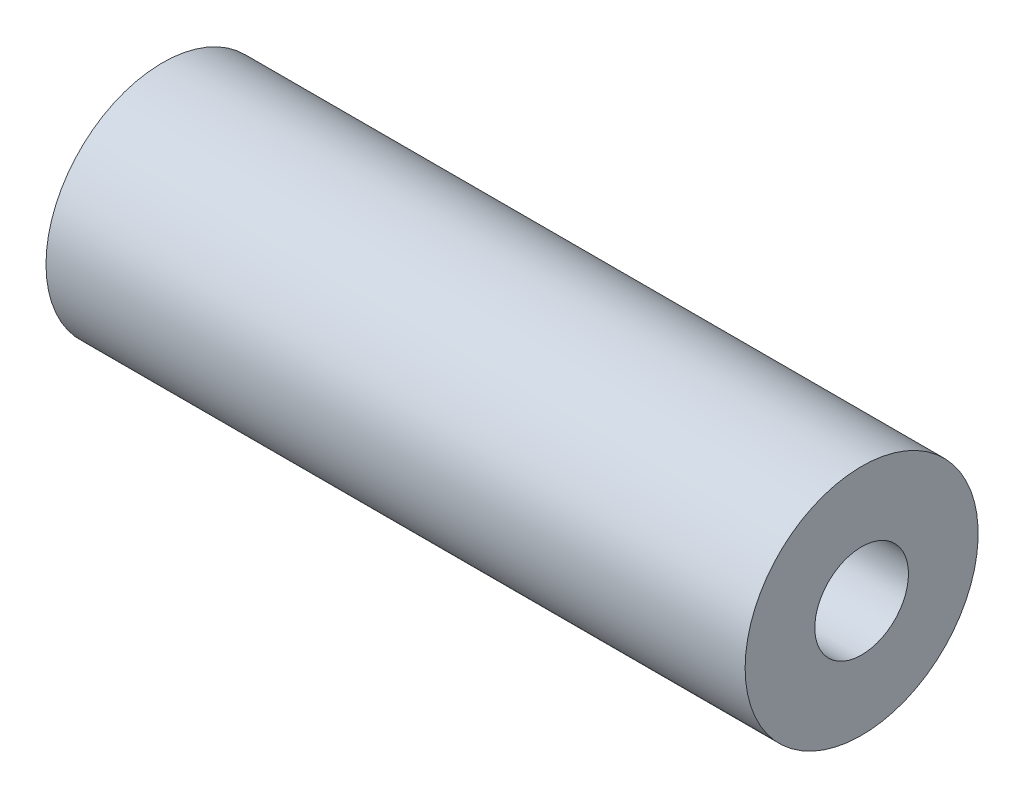
ISO-10303-21;
HEADER;
FILE_DESCRIPTION(('STEP AP214'),'2;1');
FILE_NAME('part.step','',(''),(''),'','','');
FILE_SCHEMA(('AUTOMOTIVE_DESIGN { 1 0 10303 214 1 1 1 1 }'));
ENDSEC;
DATA;
#1=APPLICATION_CONTEXT('core data for automotive mechanical design processes');
#2=APPLICATION_PROTOCOL_DEFINITION('international standard','automotive_design',2000,#1);
#3=PRODUCT_CONTEXT('',#1,'mechanical');
#4=PRODUCT('Part','Part','',(#3));
#5=PRODUCT_RELATED_PRODUCT_CATEGORY('part','',(#4));
#6=PRODUCT_DEFINITION_FORMATION('','',#4);
#7=PRODUCT_DEFINITION_CONTEXT('part definition',#1,'design');
#8=PRODUCT_DEFINITION('design','',#6,#7);
#9=PRODUCT_DEFINITION_SHAPE('','',#8);
#10=(LENGTH_UNIT() NAMED_UNIT(*) SI_UNIT(.MILLI.,.METRE.));
#11=(NAMED_UNIT(*) PLANE_ANGLE_UNIT() SI_UNIT($,.RADIAN.));
#12=(NAMED_UNIT(*) SI_UNIT($,.STERADIAN.) SOLID_ANGLE_UNIT());
#13=UNCERTAINTY_MEASURE_WITH_UNIT(LENGTH_MEASURE(1.E-05),#10,'distance_accuracy_value','');
#14=(GEOMETRIC_REPRESENTATION_CONTEXT(3) GLOBAL_UNCERTAINTY_ASSIGNED_CONTEXT((#13)) GLOBAL_UNIT_ASSIGNED_CONTEXT((#10,
#11,#12)) REPRESENTATION_CONTEXT('',''));
#15=CARTESIAN_POINT('',(0.,0.,0.));
#16=DIRECTION('',(0.,0.,1.));
#17=DIRECTION('',(1.,0.,0.));
#18=AXIS2_PLACEMENT_3D('',#15,#16,#17);
#19=CARTESIAN_POINT('',(38.1,0.,0.));
#20=DIRECTION('',(-1.,0.,0.));
#21=DIRECTION('',(0.,0.,1.));
#22=AXIS2_PLACEMENT_3D('',#19,#20,#21);
#23=CYLINDRICAL_SURFACE('',#22,6.35);
#24=CARTESIAN_POINT('',(38.1,0.,0.));
#25=DIRECTION('',(1.,0.,0.));
#26=DIRECTION('',(0.,0.,-1.));
#27=AXIS2_PLACEMENT_3D('',#24,#25,#26);
#28=CIRCLE('',#27,6.35);
#29=CARTESIAN_POINT('',(38.1,0.,6.35));
#30=VERTEX_POINT('',#29);
#31=EDGE_CURVE('E11',#30,#30,#28,.T.);
#32=CARTESIAN_POINT('',(0.,0.,0.));
#33=DIRECTION('',(1.,0.,0.));
#34=DIRECTION('',(0.,0.,-1.));
#35=AXIS2_PLACEMENT_3D('',#32,#33,#34);
#36=CIRCLE('',#35,6.35);
#37=CARTESIAN_POINT('',(0.,0.,6.35));
#38=VERTEX_POINT('',#37);
#39=EDGE_CURVE('E45',#38,#38,#36,.T.);
#40=CARTESIAN_POINT('',(38.1,0.,6.35));
#41=CARTESIAN_POINT('',(37.703125,0.,6.35));
#42=CARTESIAN_POINT('',(37.30625,0.,6.35));
#43=CARTESIAN_POINT('',(36.5125,0.,6.35));
#44=CARTESIAN_POINT('',(36.115625,0.,6.35));
#45=CARTESIAN_POINT('',(35.321875,0.,6.35));
#46=CARTESIAN_POINT('',(34.925,0.,6.35));
#47=CARTESIAN_POINT('',(34.13125,0.,6.35));
#48=CARTESIAN_POINT('',(33.734375,0.,6.35));
#49=CARTESIAN_POINT('',(32.940625,0.,6.35));
#50=CARTESIAN_POINT('',(32.54375,0.,6.35));
#51=CARTESIAN_POINT('',(31.75,0.,6.35));
#52=CARTESIAN_POINT('',(31.353125,0.,6.35));
#53=CARTESIAN_POINT('',(30.559375,0.,6.35));
#54=CARTESIAN_POINT('',(30.1625,0.,6.35));
#55=CARTESIAN_POINT('',(29.36875,0.,6.35));
#56=CARTESIAN_POINT('',(28.971875,0.,6.35));
#57=CARTESIAN_POINT('',(28.178125,0.,6.35));
#58=CARTESIAN_POINT('',(27.78125,0.,6.35));
#59=CARTESIAN_POINT('',(26.9875,0.,6.35));
#60=CARTESIAN_POINT('',(26.590625,0.,6.35));
#61=CARTESIAN_POINT('',(25.796875,0.,6.35));
#62=CARTESIAN_POINT('',(25.4,0.,6.35));
#63=CARTESIAN_POINT('',(24.60625,0.,6.35));
#64=CARTESIAN_POINT('',(24.209375,0.,6.35));
#65=CARTESIAN_POINT('',(23.415625,0.,6.35));
#66=CARTESIAN_POINT('',(23.01875,0.,6.35));
#67=CARTESIAN_POINT('',(22.225,0.,6.35));
#68=CARTESIAN_POINT('',(21.828125,0.,6.35));
#69=CARTESIAN_POINT('',(21.034375,0.,6.35));
#70=CARTESIAN_POINT('',(20.6375,0.,6.35));
#71=CARTESIAN_POINT('',(19.84375,0.,6.35));
#72=CARTESIAN_POINT('',(19.446875,0.,6.35));
#73=CARTESIAN_POINT('',(18.653125,0.,6.35));
#74=CARTESIAN_POINT('',(18.25625,0.,6.35));
#75=CARTESIAN_POINT('',(17.4625,0.,6.35));
#76=CARTESIAN_POINT('',(17.065625,0.,6.35));
#77=CARTESIAN_POINT('',(16.271875,0.,6.35));
#78=CARTESIAN_POINT('',(15.875,0.,6.35));
#79=CARTESIAN_POINT('',(15.08125,0.,6.35));
#80=CARTESIAN_POINT('',(14.684375,0.,6.35));
#81=CARTESIAN_POINT('',(13.890625,0.,6.35));
#82=CARTESIAN_POINT('',(13.49375,0.,6.35));
#83=CARTESIAN_POINT('',(12.7,0.,6.35));
#84=CARTESIAN_POINT('',(12.303125,0.,6.35));
#85=CARTESIAN_POINT('',(11.509375,0.,6.35));
#86=CARTESIAN_POINT('',(11.1125,0.,6.35));
#87=CARTESIAN_POINT('',(10.31875,0.,6.35));
#88=CARTESIAN_POINT('',(9.921875,0.,6.35));
#89=CARTESIAN_POINT('',(9.128125,0.,6.35));
#90=CARTESIAN_POINT('',(8.73125,0.,6.35));
#91=CARTESIAN_POINT('',(7.9375,0.,6.35));
#92=CARTESIAN_POINT('',(7.540625,0.,6.35));
#93=CARTESIAN_POINT('',(6.746875,0.,6.35));
#94=CARTESIAN_POINT('',(6.35,0.,6.35));
#95=CARTESIAN_POINT('',(5.55625,0.,6.35));
#96=CARTESIAN_POINT('',(5.159375,0.,6.35));
#97=CARTESIAN_POINT('',(4.365625,0.,6.35));
#98=CARTESIAN_POINT('',(3.96875,0.,6.35));
#99=CARTESIAN_POINT('',(3.175,0.,6.35));
#100=CARTESIAN_POINT('',(2.778125,0.,6.35));
#101=CARTESIAN_POINT('',(1.984375,0.,6.35));
#102=CARTESIAN_POINT('',(1.5875,0.,6.35));
#103=CARTESIAN_POINT('',(0.79375,0.,6.35));
#104=CARTESIAN_POINT('',(0.396875,0.,6.35));
#105=CARTESIAN_POINT('',(0.,0.,6.35));
#106=B_SPLINE_CURVE_WITH_KNOTS('',3,(#40,#41,#42,#43,#44,#45,#46,#47,#48,#49,#50,#51,#52,#53,
#54,#55,#56,#57,#58,#59,#60,#61,#62,#63,#64,#65,#66,#67,#68,#69,#70,#71,#72,#73,#74,#75,#76,#77,
#78,#79,#80,#81,#82,#83,#84,#85,#86,#87,#88,#89,#90,#91,#92,#93,#94,#95,#96,#97,#98,#99,#100,
#101,#102,#103,#104,#105),.UNSPECIFIED.,.F.,.F.,(4,2,2,2,2,2,2,2,2,2,2,2,2,2,2,2,2,2,2,2,2,2,2,
2,2,2,2,2,2,2,2,2,4),(0.,1.19062499999999,2.38124999999999,3.571875,4.7625,5.953125,7.14375,
8.33437499999999,9.525,10.715625,11.90625,13.096875,14.2875,15.478125,16.66875,17.859375,19.05,
20.240625,21.43125,22.621875,23.8125,25.003125,26.19375,27.384375,28.575,29.765625,30.95625,
32.146875,33.3375,34.528125,35.71875,36.909375,38.1),.UNSPECIFIED.);
#107=EDGE_CURVE('BSEAM42',#30,#38,#106,.T.);
#108=ORIENTED_EDGE('',*,*,#31,.F.);
#109=ORIENTED_EDGE('',*,*,#39,.T.);
#110=ORIENTED_EDGE('',*,*,#107,.T.);
#111=ORIENTED_EDGE('',*,*,#107,.F.);
#112=EDGE_LOOP('',(#108,#110,#109,#111));
#113=FACE_BOUND('',#112,.T.);
#114=ADVANCED_FACE('F42',(#113),#23,.T.);
#115=CARTESIAN_POINT('',(38.1,0.,0.));
#116=DIRECTION('',(1.,0.,0.));
#117=DIRECTION('',(0.,0.,-1.));
#118=AXIS2_PLACEMENT_3D('',#115,#116,#117);
#119=PLANE('',#118);
#120=CARTESIAN_POINT('',(38.1,0.,0.));
#121=DIRECTION('',(1.,0.,0.));
#122=DIRECTION('',(0.,0.,-1.));
#123=AXIS2_PLACEMENT_3D('',#120,#121,#122);
#124=CIRCLE('',#123,2.5527);
#125=CARTESIAN_POINT('',(38.1,0.,-2.5527));
#126=VERTEX_POINT('',#125);
#127=EDGE_CURVE('E68',#126,#126,#124,.T.);
#128=ORIENTED_EDGE('',*,*,#127,.F.);
#129=EDGE_LOOP('',(#128));
#130=FACE_BOUND('',#129,.T.);
#131=ORIENTED_EDGE('',*,*,#31,.T.);
#132=EDGE_LOOP('',(#131));
#133=FACE_BOUND('',#132,.T.);
#134=ADVANCED_FACE('F90',(#130,#133),#119,.T.);
#135=CARTESIAN_POINT('',(0.,0.,0.));
#136=DIRECTION('',(1.,0.,0.));
#137=DIRECTION('',(0.,0.,-1.));
#138=AXIS2_PLACEMENT_3D('',#135,#136,#137);
#139=PLANE('',#138);
#140=CARTESIAN_POINT('',(0.,0.,0.));
#141=DIRECTION('',(-1.,0.,0.));
#142=DIRECTION('',(0.,0.,1.));
#143=AXIS2_PLACEMENT_3D('',#140,#141,#142);
#144=CIRCLE('',#143,2.5527);
#145=CARTESIAN_POINT('',(0.,0.,2.5527));
#146=VERTEX_POINT('',#145);
#147=EDGE_CURVE('E67',#146,#146,#144,.T.);
#148=ORIENTED_EDGE('',*,*,#147,.F.);
#149=EDGE_LOOP('',(#148));
#150=FACE_BOUND('',#149,.T.);
#151=ORIENTED_EDGE('',*,*,#39,.F.);
#152=EDGE_LOOP('',(#151));
#153=FACE_BOUND('',#152,.T.);
#154=ADVANCED_FACE('F87',(#150,#153),#139,.F.);
#155=CARTESIAN_POINT('',(12.7,0.,0.));
#156=DIRECTION('',(-1.,0.,0.));
#157=DIRECTION('',(0.,0.,1.));
#158=AXIS2_PLACEMENT_3D('',#155,#156,#157);
#159=CONICAL_SURFACE('',#158,2.5527,1.02974425867665);
#160=CARTESIAN_POINT('',(14.2338169021917,0.,0.));
#161=VERTEX_POINT('',#160);
#162=VERTEX_LOOP('',#161);
#163=FACE_BOUND('',#162,.T.);
#164=CARTESIAN_POINT('',(12.7,0.,0.));
#165=DIRECTION('',(-1.,0.,0.));
#166=DIRECTION('',(0.,0.,1.));
#167=AXIS2_PLACEMENT_3D('',#164,#165,#166);
#168=CIRCLE('',#167,2.5527);
#169=CARTESIAN_POINT('',(12.7,0.,2.5527));
#170=VERTEX_POINT('',#169);
#171=EDGE_CURVE('E73',#170,#170,#168,.T.);
#172=ORIENTED_EDGE('',*,*,#171,.T.);
#173=EDGE_LOOP('',(#172));
#174=FACE_BOUND('',#173,.T.);
#175=ADVANCED_FACE('F89',(#163,#174),#159,.F.);
#176=CARTESIAN_POINT('',(0.,0.,0.));
#177=DIRECTION('',(-1.,0.,0.));
#178=DIRECTION('',(0.,0.,1.));
#179=AXIS2_PLACEMENT_3D('',#176,#177,#178);
#180=CYLINDRICAL_SURFACE('',#179,2.5527);
#181=ORIENTED_EDGE('',*,*,#171,.F.);
#182=EDGE_LOOP('',(#181));
#183=FACE_BOUND('',#182,.T.);
#184=ORIENTED_EDGE('',*,*,#147,.T.);
#185=EDGE_LOOP('',(#184));
#186=FACE_BOUND('',#185,.T.);
#187=ADVANCED_FACE('F60',(#183,#186),#180,.F.);
#188=CARTESIAN_POINT('',(25.4,0.,0.));
#189=DIRECTION('',(1.,0.,0.));
#190=DIRECTION('',(0.,0.,-1.));
#191=AXIS2_PLACEMENT_3D('',#188,#189,#190);
#192=CONICAL_SURFACE('',#191,2.5527,1.02974425867665);
#193=CARTESIAN_POINT('',(23.8661830978083,0.,0.));
#194=VERTEX_POINT('',#193);
#195=VERTEX_LOOP('',#194);
#196=FACE_BOUND('',#195,.T.);
#197=CARTESIAN_POINT('',(25.4,0.,0.));
#198=DIRECTION('',(1.,0.,0.));
#199=DIRECTION('',(0.,0.,-1.));
#200=AXIS2_PLACEMENT_3D('',#197,#198,#199);
#201=CIRCLE('',#200,2.5527);
#202=CARTESIAN_POINT('',(25.4,0.,-2.5527));
#203=VERTEX_POINT('',#202);
#204=EDGE_CURVE('E64',#203,#203,#201,.T.);
#205=ORIENTED_EDGE('',*,*,#204,.T.);
#206=EDGE_LOOP('',(#205));
#207=FACE_BOUND('',#206,.T.);
#208=ADVANCED_FACE('F56',(#196,#207),#192,.F.);
#209=CARTESIAN_POINT('',(38.1,0.,0.));
#210=DIRECTION('',(1.,0.,0.));
#211=DIRECTION('',(0.,0.,-1.));
#212=AXIS2_PLACEMENT_3D('',#209,#210,#211);
#213=CYLINDRICAL_SURFACE('',#212,2.5527);
#214=ORIENTED_EDGE('',*,*,#204,.F.);
#215=EDGE_LOOP('',(#214));
#216=FACE_BOUND('',#215,.T.);
#217=ORIENTED_EDGE('',*,*,#127,.T.);
#218=EDGE_LOOP('',(#217));
#219=FACE_BOUND('',#218,.T.);
#220=ADVANCED_FACE('F59',(#216,#219),#213,.F.);
#221=CLOSED_SHELL('',(#114,#134,#154,#175,#187,#208,#220));
#222=MANIFOLD_SOLID_BREP('B2',#221);
#223=ADVANCED_BREP_SHAPE_REPRESENTATION('',(#18,#222),#14);
#224=SHAPE_DEFINITION_REPRESENTATION(#9,#223);
ENDSEC;
END-ISO-10303-21;
